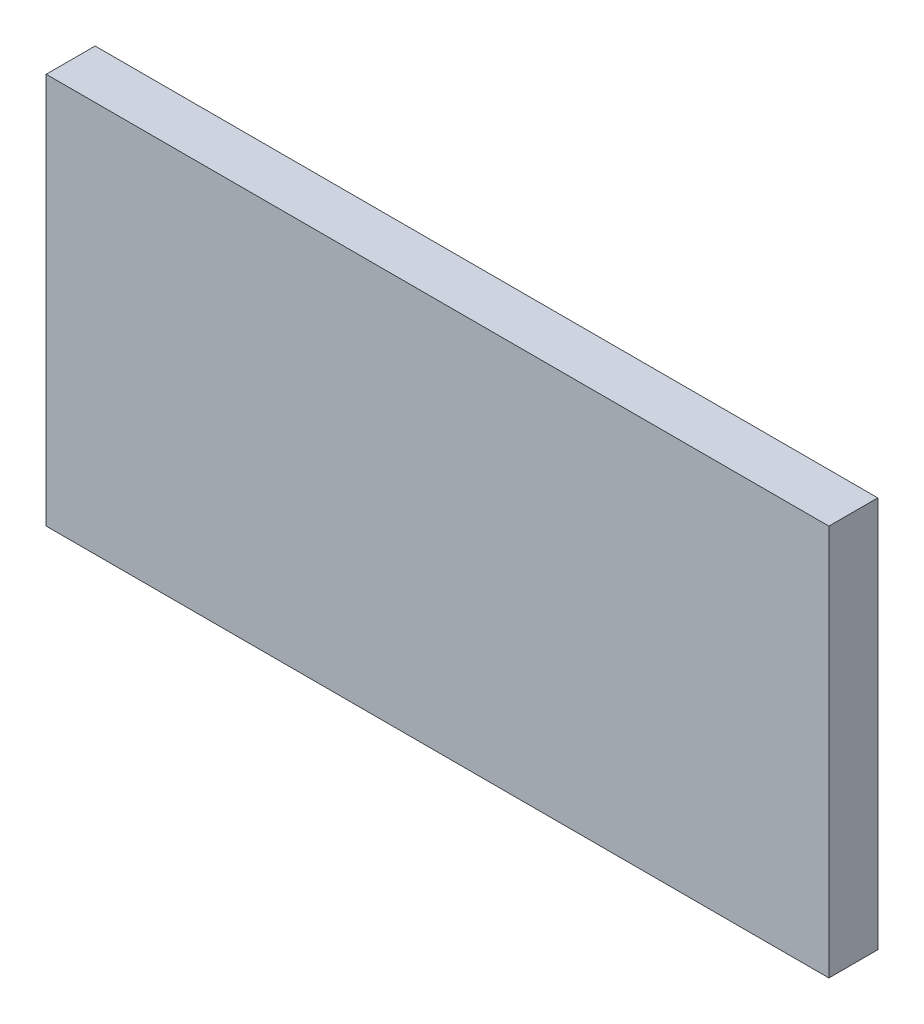
ISO-10303-21;
HEADER;
FILE_DESCRIPTION(('STEP AP214'),'2;1');
FILE_NAME('part.step','',(''),(''),'','','');
FILE_SCHEMA(('AUTOMOTIVE_DESIGN { 1 0 10303 214 1 1 1 1 }'));
ENDSEC;
DATA;
#1=APPLICATION_CONTEXT('core data for automotive mechanical design processes');
#2=APPLICATION_PROTOCOL_DEFINITION('international standard','automotive_design',2000,#1);
#3=PRODUCT_CONTEXT('',#1,'mechanical');
#4=PRODUCT('Part','Part','',(#3));
#5=PRODUCT_RELATED_PRODUCT_CATEGORY('part','',(#4));
#6=PRODUCT_DEFINITION_FORMATION('','',#4);
#7=PRODUCT_DEFINITION_CONTEXT('part definition',#1,'design');
#8=PRODUCT_DEFINITION('design','',#6,#7);
#9=PRODUCT_DEFINITION_SHAPE('','',#8);
#10=(LENGTH_UNIT() NAMED_UNIT(*) SI_UNIT(.MILLI.,.METRE.));
#11=(NAMED_UNIT(*) PLANE_ANGLE_UNIT() SI_UNIT($,.RADIAN.));
#12=(NAMED_UNIT(*) SI_UNIT($,.STERADIAN.) SOLID_ANGLE_UNIT());
#13=UNCERTAINTY_MEASURE_WITH_UNIT(LENGTH_MEASURE(1.E-05),#10,'distance_accuracy_value','');
#14=(GEOMETRIC_REPRESENTATION_CONTEXT(3) GLOBAL_UNCERTAINTY_ASSIGNED_CONTEXT((#13)) GLOBAL_UNIT_ASSIGNED_CONTEXT((#10,
#11,#12)) REPRESENTATION_CONTEXT('',''));
#15=CARTESIAN_POINT('',(0.,0.,0.));
#16=DIRECTION('',(0.,0.,1.));
#17=DIRECTION('',(1.,0.,0.));
#18=AXIS2_PLACEMENT_3D('',#15,#16,#17);
#19=CARTESIAN_POINT('',(0.,0.,3.175));
#20=DIRECTION('',(1.,0.,0.));
#21=DIRECTION('',(0.,0.,-1.));
#22=AXIS2_PLACEMENT_3D('',#19,#20,#21);
#23=PLANE('',#22);
#24=DIRECTION('',(0.,-1.,0.));
#25=VECTOR('',#24,1.);
#26=CARTESIAN_POINT('',(0.,0.,0.));
#27=LINE('',#26,#25);
#28=CARTESIAN_POINT('',(0.,25.4,0.));
#29=VERTEX_POINT('',#28);
#30=CARTESIAN_POINT('',(0.,0.,0.));
#31=VERTEX_POINT('',#30);
#32=EDGE_CURVE('E96',#29,#31,#27,.T.);
#33=ORIENTED_EDGE('',*,*,#32,.T.);
#34=DIRECTION('',(0.,0.,-1.));
#35=VECTOR('',#34,1.);
#36=CARTESIAN_POINT('',(0.,0.,3.175));
#37=LINE('',#36,#35);
#38=CARTESIAN_POINT('',(0.,0.,3.175));
#39=VERTEX_POINT('',#38);
#40=EDGE_CURVE('E11',#39,#31,#37,.T.);
#41=ORIENTED_EDGE('',*,*,#40,.F.);
#42=DIRECTION('',(0.,-1.,0.));
#43=VECTOR('',#42,1.);
#44=CARTESIAN_POINT('',(0.,0.,3.175));
#45=LINE('',#44,#43);
#46=CARTESIAN_POINT('',(0.,25.4,3.175));
#47=VERTEX_POINT('',#46);
#48=EDGE_CURVE('E84',#47,#39,#45,.T.);
#49=ORIENTED_EDGE('',*,*,#48,.F.);
#50=DIRECTION('',(0.,0.,-1.));
#51=VECTOR('',#50,1.);
#52=CARTESIAN_POINT('',(0.,25.4,3.175));
#53=LINE('',#52,#51);
#54=EDGE_CURVE('E92',#47,#29,#53,.T.);
#55=ORIENTED_EDGE('',*,*,#54,.T.);
#56=EDGE_LOOP('',(#33,#41,#49,#55));
#57=FACE_BOUND('',#56,.T.);
#58=ADVANCED_FACE('F33',(#57),#23,.F.);
#59=CARTESIAN_POINT('',(0.,0.,3.175));
#60=DIRECTION('',(0.,1.,0.));
#61=DIRECTION('',(0.,0.,1.));
#62=AXIS2_PLACEMENT_3D('',#59,#60,#61);
#63=PLANE('',#62);
#64=DIRECTION('',(1.,0.,0.));
#65=VECTOR('',#64,1.);
#66=CARTESIAN_POINT('',(0.,0.,0.));
#67=LINE('',#66,#65);
#68=CARTESIAN_POINT('',(50.8,0.,0.));
#69=VERTEX_POINT('',#68);
#70=EDGE_CURVE('E88',#31,#69,#67,.T.);
#71=ORIENTED_EDGE('',*,*,#70,.T.);
#72=DIRECTION('',(0.,0.,-1.));
#73=VECTOR('',#72,1.);
#74=CARTESIAN_POINT('',(50.8,0.,3.175));
#75=LINE('',#74,#73);
#76=CARTESIAN_POINT('',(50.8,0.,3.175));
#77=VERTEX_POINT('',#76);
#78=EDGE_CURVE('E41',#77,#69,#75,.T.);
#79=ORIENTED_EDGE('',*,*,#78,.F.);
#80=DIRECTION('',(1.,0.,0.));
#81=VECTOR('',#80,1.);
#82=CARTESIAN_POINT('',(0.,0.,3.175));
#83=LINE('',#82,#81);
#84=EDGE_CURVE('E79',#39,#77,#83,.T.);
#85=ORIENTED_EDGE('',*,*,#84,.F.);
#86=ORIENTED_EDGE('',*,*,#40,.T.);
#87=EDGE_LOOP('',(#71,#79,#85,#86));
#88=FACE_BOUND('',#87,.T.);
#89=ADVANCED_FACE('F87',(#88),#63,.F.);
#90=CARTESIAN_POINT('',(50.8,0.,3.175));
#91=DIRECTION('',(-1.,0.,0.));
#92=DIRECTION('',(0.,0.,1.));
#93=AXIS2_PLACEMENT_3D('',#90,#91,#92);
#94=PLANE('',#93);
#95=DIRECTION('',(0.,1.,0.));
#96=VECTOR('',#95,1.);
#97=CARTESIAN_POINT('',(50.8,0.,0.));
#98=LINE('',#97,#96);
#99=CARTESIAN_POINT('',(50.8,25.4,0.));
#100=VERTEX_POINT('',#99);
#101=EDGE_CURVE('E66',#69,#100,#98,.T.);
#102=ORIENTED_EDGE('',*,*,#101,.T.);
#103=DIRECTION('',(0.,0.,-1.));
#104=VECTOR('',#103,1.);
#105=CARTESIAN_POINT('',(50.8,25.4,3.175));
#106=LINE('',#105,#104);
#107=CARTESIAN_POINT('',(50.8,25.4,3.175));
#108=VERTEX_POINT('',#107);
#109=EDGE_CURVE('E89',#108,#100,#106,.T.);
#110=ORIENTED_EDGE('',*,*,#109,.F.);
#111=DIRECTION('',(0.,1.,0.));
#112=VECTOR('',#111,1.);
#113=CARTESIAN_POINT('',(50.8,0.,3.175));
#114=LINE('',#113,#112);
#115=EDGE_CURVE('E82',#77,#108,#114,.T.);
#116=ORIENTED_EDGE('',*,*,#115,.F.);
#117=ORIENTED_EDGE('',*,*,#78,.T.);
#118=EDGE_LOOP('',(#102,#110,#116,#117));
#119=FACE_BOUND('',#118,.T.);
#120=ADVANCED_FACE('F90',(#119),#94,.F.);
#121=CARTESIAN_POINT('',(0.,25.4,3.175));
#122=DIRECTION('',(0.,-1.,0.));
#123=DIRECTION('',(0.,0.,-1.));
#124=AXIS2_PLACEMENT_3D('',#121,#122,#123);
#125=PLANE('',#124);
#126=DIRECTION('',(-1.,0.,0.));
#127=VECTOR('',#126,1.);
#128=CARTESIAN_POINT('',(0.,25.4,0.));
#129=LINE('',#128,#127);
#130=EDGE_CURVE('E72',#100,#29,#129,.T.);
#131=ORIENTED_EDGE('',*,*,#130,.T.);
#132=ORIENTED_EDGE('',*,*,#54,.F.);
#133=DIRECTION('',(-1.,0.,0.));
#134=VECTOR('',#133,1.);
#135=CARTESIAN_POINT('',(0.,25.4,3.175));
#136=LINE('',#135,#134);
#137=EDGE_CURVE('E49',#108,#47,#136,.T.);
#138=ORIENTED_EDGE('',*,*,#137,.F.);
#139=ORIENTED_EDGE('',*,*,#109,.T.);
#140=EDGE_LOOP('',(#131,#132,#138,#139));
#141=FACE_BOUND('',#140,.T.);
#142=ADVANCED_FACE('F103',(#141),#125,.F.);
#143=CARTESIAN_POINT('',(0.,0.,3.175));
#144=DIRECTION('',(0.,0.,-1.));
#145=DIRECTION('',(-1.,0.,0.));
#146=AXIS2_PLACEMENT_3D('',#143,#144,#145);
#147=PLANE('',#146);
#148=ORIENTED_EDGE('',*,*,#48,.T.);
#149=ORIENTED_EDGE('',*,*,#84,.T.);
#150=ORIENTED_EDGE('',*,*,#115,.T.);
#151=ORIENTED_EDGE('',*,*,#137,.T.);
#152=EDGE_LOOP('',(#148,#149,#150,#151));
#153=FACE_BOUND('',#152,.T.);
#154=ADVANCED_FACE('F80',(#153),#147,.F.);
#155=CARTESIAN_POINT('',(0.,0.,0.));
#156=DIRECTION('',(0.,0.,-1.));
#157=DIRECTION('',(-1.,0.,0.));
#158=AXIS2_PLACEMENT_3D('',#155,#156,#157);
#159=PLANE('',#158);
#160=ORIENTED_EDGE('',*,*,#32,.F.);
#161=ORIENTED_EDGE('',*,*,#130,.F.);
#162=ORIENTED_EDGE('',*,*,#101,.F.);
#163=ORIENTED_EDGE('',*,*,#70,.F.);
#164=EDGE_LOOP('',(#160,#161,#162,#163));
#165=FACE_BOUND('',#164,.T.);
#166=ADVANCED_FACE('F106',(#165),#159,.T.);
#167=CLOSED_SHELL('',(#58,#89,#120,#142,#154,#166));
#168=MANIFOLD_SOLID_BREP('B2',#167);
#169=ADVANCED_BREP_SHAPE_REPRESENTATION('',(#18,#168),#14);
#170=SHAPE_DEFINITION_REPRESENTATION(#9,#169);
ENDSEC;
END-ISO-10303-21;
